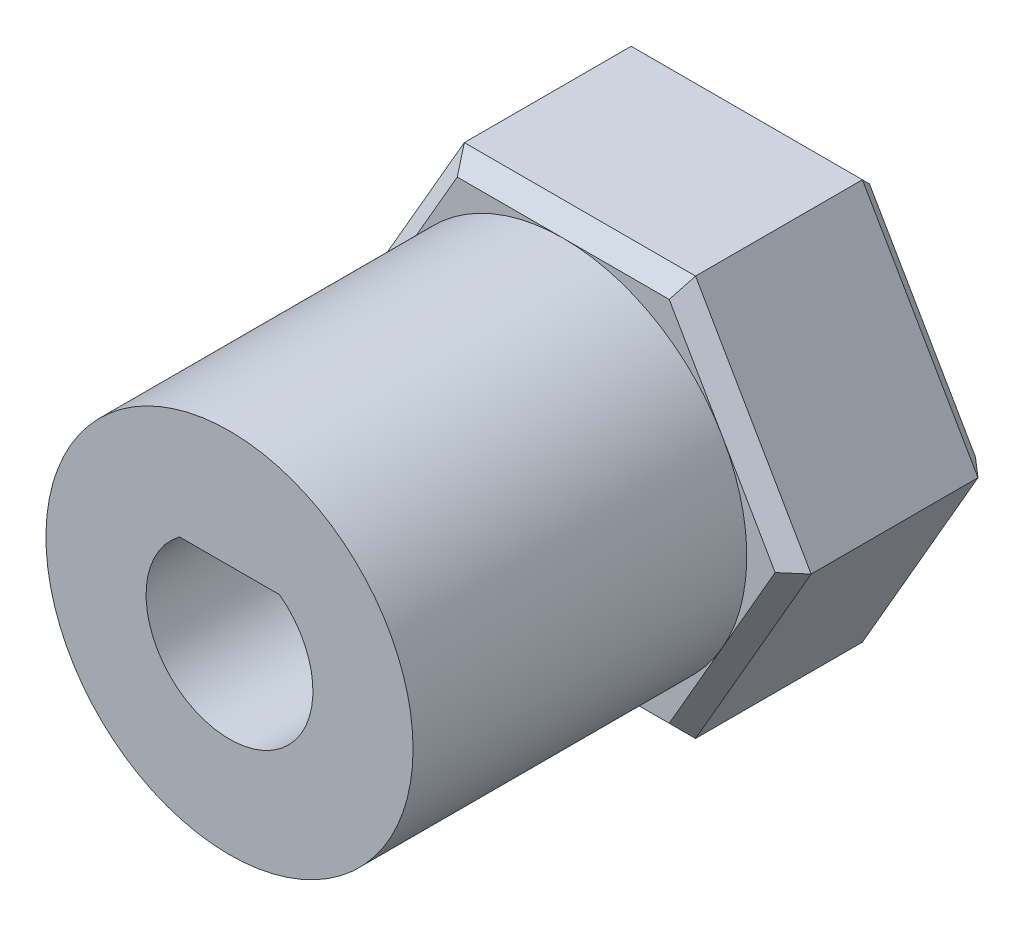
ISO-10303-21;
HEADER;
FILE_DESCRIPTION(('STEP AP214'),'2;1');
FILE_NAME('part.step','',(''),(''),'','','');
FILE_SCHEMA(('AUTOMOTIVE_DESIGN { 1 0 10303 214 1 1 1 1 }'));
ENDSEC;
DATA;
#1=APPLICATION_CONTEXT('core data for automotive mechanical design processes');
#2=APPLICATION_PROTOCOL_DEFINITION('international standard','automotive_design',2000,#1);
#3=PRODUCT_CONTEXT('',#1,'mechanical');
#4=PRODUCT('Part','Part','',(#3));
#5=PRODUCT_RELATED_PRODUCT_CATEGORY('part','',(#4));
#6=PRODUCT_DEFINITION_FORMATION('','',#4);
#7=PRODUCT_DEFINITION_CONTEXT('part definition',#1,'design');
#8=PRODUCT_DEFINITION('design','',#6,#7);
#9=PRODUCT_DEFINITION_SHAPE('','',#8);
#10=(LENGTH_UNIT() NAMED_UNIT(*) SI_UNIT(.MILLI.,.METRE.));
#11=(NAMED_UNIT(*) PLANE_ANGLE_UNIT() SI_UNIT($,.RADIAN.));
#12=(NAMED_UNIT(*) SI_UNIT($,.STERADIAN.) SOLID_ANGLE_UNIT());
#13=UNCERTAINTY_MEASURE_WITH_UNIT(LENGTH_MEASURE(1.E-05),#10,'distance_accuracy_value','');
#14=(GEOMETRIC_REPRESENTATION_CONTEXT(3) GLOBAL_UNCERTAINTY_ASSIGNED_CONTEXT((#13)) GLOBAL_UNIT_ASSIGNED_CONTEXT((#10,
#11,#12)) REPRESENTATION_CONTEXT('',''));
#15=CARTESIAN_POINT('',(0.,0.,0.));
#16=DIRECTION('',(0.,0.,1.));
#17=DIRECTION('',(1.,0.,0.));
#18=AXIS2_PLACEMENT_3D('',#15,#16,#17);
#19=CARTESIAN_POINT('',(0.,0.,6.));
#20=DIRECTION('',(0.,0.,1.));
#21=DIRECTION('',(1.,0.,0.));
#22=AXIS2_PLACEMENT_3D('',#19,#20,#21);
#23=PLANE('',#22);
#24=CARTESIAN_POINT('',(0.,0.,6.));
#25=DIRECTION('',(0.,0.,1.));
#26=DIRECTION('',(1.,0.,0.));
#27=AXIS2_PLACEMENT_3D('',#24,#25,#26);
#28=CIRCLE('',#27,5.5);
#29=CARTESIAN_POINT('',(4.76313972081441,2.75,6.));
#30=VERTEX_POINT('',#29);
#31=CARTESIAN_POINT('',(0.,5.5,6.));
#32=VERTEX_POINT('',#31);
#33=EDGE_CURVE('E60',#30,#32,#28,.T.);
#34=ORIENTED_EDGE('',*,*,#33,.F.);
#35=DIRECTION('',(-0.5,0.866025403784439,0.));
#36=VECTOR('',#35,1.);
#37=CARTESIAN_POINT('',(3.03108891324553,5.75,6.));
#38=LINE('',#37,#36);
#39=CARTESIAN_POINT('',(3.17542648054294,5.5,6.));
#40=VERTEX_POINT('',#39);
#41=EDGE_CURVE('E246',#30,#40,#38,.T.);
#42=ORIENTED_EDGE('',*,*,#41,.T.);
#43=DIRECTION('',(-1.,0.,0.));
#44=VECTOR('',#43,1.);
#45=CARTESIAN_POINT('',(-3.46410161513775,5.5,6.));
#46=LINE('',#45,#44);
#47=EDGE_CURVE('E242',#40,#32,#46,.T.);
#48=ORIENTED_EDGE('',*,*,#47,.T.);
#49=EDGE_LOOP('',(#34,#42,#48));
#50=FACE_BOUND('',#49,.T.);
#51=ADVANCED_FACE('F47',(#50),#23,.T.);
#52=CARTESIAN_POINT('',(-4.76313972081441,2.75,6.));
#53=VERTEX_POINT('',#52);
#54=EDGE_CURVE('E11',#32,#53,#28,.T.);
#55=ORIENTED_EDGE('',*,*,#54,.F.);
#56=CARTESIAN_POINT('',(-3.17542648054294,5.5,6.));
#57=VERTEX_POINT('',#56);
#58=EDGE_CURVE('E241',#32,#57,#46,.T.);
#59=ORIENTED_EDGE('',*,*,#58,.T.);
#60=DIRECTION('',(-0.5,-0.866025403784438,0.));
#61=VECTOR('',#60,1.);
#62=CARTESIAN_POINT('',(-6.49519052838329,-0.249999999999999,6.));
#63=LINE('',#62,#61);
#64=EDGE_CURVE('E238',#57,#53,#63,.T.);
#65=ORIENTED_EDGE('',*,*,#64,.T.);
#66=EDGE_LOOP('',(#55,#59,#65));
#67=FACE_BOUND('',#66,.T.);
#68=ADVANCED_FACE('F450',(#67),#23,.T.);
#69=CARTESIAN_POINT('',(-4.76313972081441,-2.75,6.));
#70=VERTEX_POINT('',#69);
#71=EDGE_CURVE('E58',#53,#70,#28,.T.);
#72=ORIENTED_EDGE('',*,*,#71,.F.);
#73=CARTESIAN_POINT('',(-6.35085296108588,0.,6.));
#74=VERTEX_POINT('',#73);
#75=EDGE_CURVE('E237',#53,#74,#63,.T.);
#76=ORIENTED_EDGE('',*,*,#75,.T.);
#77=DIRECTION('',(0.5,-0.866025403784439,0.));
#78=VECTOR('',#77,1.);
#79=CARTESIAN_POINT('',(-3.03108891324554,-5.75,6.));
#80=LINE('',#79,#78);
#81=EDGE_CURVE('E261',#74,#70,#80,.T.);
#82=ORIENTED_EDGE('',*,*,#81,.T.);
#83=EDGE_LOOP('',(#72,#76,#82));
#84=FACE_BOUND('',#83,.T.);
#85=ADVANCED_FACE('F449',(#84),#23,.T.);
#86=CARTESIAN_POINT('',(0.,-5.5,6.));
#87=VERTEX_POINT('',#86);
#88=EDGE_CURVE('E417',#70,#87,#28,.T.);
#89=ORIENTED_EDGE('',*,*,#88,.F.);
#90=CARTESIAN_POINT('',(-3.17542648054294,-5.49999999999999,6.));
#91=VERTEX_POINT('',#90);
#92=EDGE_CURVE('E260',#70,#91,#80,.T.);
#93=ORIENTED_EDGE('',*,*,#92,.T.);
#94=DIRECTION('',(1.,0.,0.));
#95=VECTOR('',#94,1.);
#96=CARTESIAN_POINT('',(3.46410161513775,-5.5,6.));
#97=LINE('',#96,#95);
#98=EDGE_CURVE('E256',#91,#87,#97,.T.);
#99=ORIENTED_EDGE('',*,*,#98,.T.);
#100=EDGE_LOOP('',(#89,#93,#99));
#101=FACE_BOUND('',#100,.T.);
#102=ADVANCED_FACE('F416',(#101),#23,.T.);
#103=CARTESIAN_POINT('',(4.76313972081441,-2.75,6.));
#104=VERTEX_POINT('',#103);
#105=EDGE_CURVE('E423',#87,#104,#28,.T.);
#106=ORIENTED_EDGE('',*,*,#105,.F.);
#107=CARTESIAN_POINT('',(3.17542648054294,-5.5,6.));
#108=VERTEX_POINT('',#107);
#109=EDGE_CURVE('E255',#87,#108,#97,.T.);
#110=ORIENTED_EDGE('',*,*,#109,.T.);
#111=DIRECTION('',(0.5,0.866025403784438,0.));
#112=VECTOR('',#111,1.);
#113=CARTESIAN_POINT('',(6.49519052838329,0.25,6.));
#114=LINE('',#113,#112);
#115=EDGE_CURVE('E251',#108,#104,#114,.T.);
#116=ORIENTED_EDGE('',*,*,#115,.T.);
#117=EDGE_LOOP('',(#106,#110,#116));
#118=FACE_BOUND('',#117,.T.);
#119=ADVANCED_FACE('F442',(#118),#23,.T.);
#120=CARTESIAN_POINT('',(0.,0.,6.));
#121=DIRECTION('',(0.,0.,1.));
#122=DIRECTION('',(1.,0.,0.));
#123=AXIS2_PLACEMENT_3D('',#120,#121,#122);
#124=CIRCLE('',#123,1.75);
#125=CARTESIAN_POINT('',(1.75,0.,6.));
#126=VERTEX_POINT('',#125);
#127=EDGE_CURVE('E204',#126,#126,#124,.T.);
#128=ORIENTED_EDGE('',*,*,#127,.F.);
#129=EDGE_LOOP('',(#128));
#130=FACE_BOUND('',#129,.T.);
#131=DIRECTION('',(-1.,0.,0.));
#132=VECTOR('',#131,1.);
#133=CARTESIAN_POINT('',(-1.5,2.,6.));
#134=LINE('',#133,#132);
#135=CARTESIAN_POINT('',(1.5,2.,6.));
#136=VERTEX_POINT('',#135);
#137=CARTESIAN_POINT('',(-1.5,2.,6.));
#138=VERTEX_POINT('',#137);
#139=EDGE_CURVE('E187',#136,#138,#134,.T.);
#140=ORIENTED_EDGE('',*,*,#139,.T.);
#141=CARTESIAN_POINT('',(0.,0.,6.));
#142=DIRECTION('',(0.,0.,1.));
#143=DIRECTION('',(1.,0.,0.));
#144=AXIS2_PLACEMENT_3D('',#141,#142,#143);
#145=CIRCLE('',#144,2.5);
#146=EDGE_CURVE('E181',#138,#136,#145,.T.);
#147=ORIENTED_EDGE('',*,*,#146,.T.);
#148=EDGE_LOOP('',(#140,#147));
#149=FACE_BOUND('',#148,.T.);
#150=ADVANCED_FACE('F494',(#130,#149),#23,.T.);
#151=EDGE_CURVE('E203',#104,#30,#28,.T.);
#152=ORIENTED_EDGE('',*,*,#151,.F.);
#153=CARTESIAN_POINT('',(6.35085296108588,0.,6.));
#154=VERTEX_POINT('',#153);
#155=EDGE_CURVE('E250',#104,#154,#114,.T.);
#156=ORIENTED_EDGE('',*,*,#155,.T.);
#157=EDGE_CURVE('E247',#154,#30,#38,.T.);
#158=ORIENTED_EDGE('',*,*,#157,.T.);
#159=EDGE_LOOP('',(#152,#156,#158));
#160=FACE_BOUND('',#159,.T.);
#161=ADVANCED_FACE('F431',(#160),#23,.T.);
#162=CARTESIAN_POINT('',(0.,0.,0.));
#163=DIRECTION('',(0.,0.,1.));
#164=DIRECTION('',(1.,0.,0.));
#165=AXIS2_PLACEMENT_3D('',#162,#163,#164);
#166=PLANE('',#165);
#167=DIRECTION('',(-0.5,0.866025403784439,0.));
#168=VECTOR('',#167,1.);
#169=CARTESIAN_POINT('',(-4.76313972081441,-2.75,0.));
#170=LINE('',#169,#168);
#171=CARTESIAN_POINT('',(-3.17542648054294,-5.49999999999999,0.));
#172=VERTEX_POINT('',#171);
#173=CARTESIAN_POINT('',(-6.35085296108588,0.,0.));
#174=VERTEX_POINT('',#173);
#175=EDGE_CURVE('E315',#172,#174,#170,.T.);
#176=ORIENTED_EDGE('',*,*,#175,.T.);
#177=DIRECTION('',(0.5,0.866025403784438,0.));
#178=VECTOR('',#177,1.);
#179=CARTESIAN_POINT('',(-4.76313972081441,2.75,0.));
#180=LINE('',#179,#178);
#181=CARTESIAN_POINT('',(-3.17542648054294,5.5,0.));
#182=VERTEX_POINT('',#181);
#183=EDGE_CURVE('E318',#174,#182,#180,.T.);
#184=ORIENTED_EDGE('',*,*,#183,.T.);
#185=DIRECTION('',(1.,0.,0.));
#186=VECTOR('',#185,1.);
#187=CARTESIAN_POINT('',(0.,5.5,0.));
#188=LINE('',#187,#186);
#189=CARTESIAN_POINT('',(3.17542648054294,5.5,0.));
#190=VERTEX_POINT('',#189);
#191=EDGE_CURVE('E303',#182,#190,#188,.T.);
#192=ORIENTED_EDGE('',*,*,#191,.T.);
#193=DIRECTION('',(0.5,-0.866025403784439,0.));
#194=VECTOR('',#193,1.);
#195=CARTESIAN_POINT('',(4.76313972081441,2.75,0.));
#196=LINE('',#195,#194);
#197=CARTESIAN_POINT('',(6.35085296108588,0.,0.));
#198=VERTEX_POINT('',#197);
#199=EDGE_CURVE('E306',#190,#198,#196,.T.);
#200=ORIENTED_EDGE('',*,*,#199,.T.);
#201=DIRECTION('',(-0.5,-0.866025403784438,0.));
#202=VECTOR('',#201,1.);
#203=CARTESIAN_POINT('',(4.76313972081441,-2.75,0.));
#204=LINE('',#203,#202);
#205=CARTESIAN_POINT('',(3.17542648054294,-5.49999999999999,0.));
#206=VERTEX_POINT('',#205);
#207=EDGE_CURVE('E309',#198,#206,#204,.T.);
#208=ORIENTED_EDGE('',*,*,#207,.T.);
#209=DIRECTION('',(-1.,0.,0.));
#210=VECTOR('',#209,1.);
#211=CARTESIAN_POINT('',(0.,-5.49999999999999,0.));
#212=LINE('',#211,#210);
#213=EDGE_CURVE('E312',#206,#172,#212,.T.);
#214=ORIENTED_EDGE('',*,*,#213,.T.);
#215=EDGE_LOOP('',(#176,#184,#192,#200,#208,#214));
#216=FACE_BOUND('',#215,.T.);
#217=CARTESIAN_POINT('',(0.,0.,0.));
#218=DIRECTION('',(0.,0.,1.));
#219=DIRECTION('',(1.,0.,0.));
#220=AXIS2_PLACEMENT_3D('',#217,#218,#219);
#221=CIRCLE('',#220,1.75);
#222=CARTESIAN_POINT('',(1.75,0.,0.));
#223=VERTEX_POINT('',#222);
#224=EDGE_CURVE('E209',#223,#223,#221,.T.);
#225=ORIENTED_EDGE('',*,*,#224,.T.);
#226=EDGE_LOOP('',(#225));
#227=FACE_BOUND('',#226,.T.);
#228=ADVANCED_FACE('F375',(#216,#227),#166,.F.);
#229=CARTESIAN_POINT('',(6.92820323027551,0.,6.));
#230=DIRECTION('',(-0.866025403784439,-0.5,0.));
#231=DIRECTION('',(0.5,-0.866025403784439,0.));
#232=AXIS2_PLACEMENT_3D('',#229,#230,#231);
#233=PLANE('',#232);
#234=DIRECTION('',(0.,0.,-1.));
#235=VECTOR('',#234,1.);
#236=CARTESIAN_POINT('',(3.46410161513775,6.,6.));
#237=LINE('',#236,#235);
#238=CARTESIAN_POINT('',(3.46410161513775,6.,5.5));
#239=VERTEX_POINT('',#238);
#240=CARTESIAN_POINT('',(3.46410161513775,6.,0.500000000000004));
#241=VERTEX_POINT('',#240);
#242=EDGE_CURVE('E233',#239,#241,#237,.T.);
#243=ORIENTED_EDGE('',*,*,#242,.F.);
#244=DIRECTION('',(0.5,-0.866025403784439,0.));
#245=VECTOR('',#244,1.);
#246=CARTESIAN_POINT('',(6.92820323027551,0.,5.5));
#247=LINE('',#246,#245);
#248=CARTESIAN_POINT('',(6.92820323027551,0.,5.5));
#249=VERTEX_POINT('',#248);
#250=EDGE_CURVE('E287',#239,#249,#247,.T.);
#251=ORIENTED_EDGE('',*,*,#250,.T.);
#252=DIRECTION('',(0.,0.,-1.));
#253=VECTOR('',#252,1.);
#254=CARTESIAN_POINT('',(6.92820323027551,0.,6.));
#255=LINE('',#254,#253);
#256=CARTESIAN_POINT('',(6.92820323027551,0.,0.500000000000004));
#257=VERTEX_POINT('',#256);
#258=EDGE_CURVE('E208',#249,#257,#255,.T.);
#259=ORIENTED_EDGE('',*,*,#258,.T.);
#260=DIRECTION('',(-0.5,0.866025403784439,0.));
#261=VECTOR('',#260,1.);
#262=CARTESIAN_POINT('',(6.92820323027551,0.,0.500000000000004));
#263=LINE('',#262,#261);
#264=EDGE_CURVE('E284',#257,#241,#263,.T.);
#265=ORIENTED_EDGE('',*,*,#264,.T.);
#266=EDGE_LOOP('',(#243,#251,#259,#265));
#267=FACE_BOUND('',#266,.T.);
#268=ADVANCED_FACE('F457',(#267),#233,.F.);
#269=CARTESIAN_POINT('',(3.46410161513775,6.,6.));
#270=DIRECTION('',(0.,-1.,0.));
#271=DIRECTION('',(0.,0.,-1.));
#272=AXIS2_PLACEMENT_3D('',#269,#270,#271);
#273=PLANE('',#272);
#274=DIRECTION('',(0.,0.,-1.));
#275=VECTOR('',#274,1.);
#276=CARTESIAN_POINT('',(-3.46410161513775,6.,6.));
#277=LINE('',#276,#275);
#278=CARTESIAN_POINT('',(-3.46410161513775,6.,5.5));
#279=VERTEX_POINT('',#278);
#280=CARTESIAN_POINT('',(-3.46410161513775,6.,0.500000000000004));
#281=VERTEX_POINT('',#280);
#282=EDGE_CURVE('E229',#279,#281,#277,.T.);
#283=ORIENTED_EDGE('',*,*,#282,.F.);
#284=DIRECTION('',(1.,0.,0.));
#285=VECTOR('',#284,1.);
#286=CARTESIAN_POINT('',(3.46410161513775,6.,5.5));
#287=LINE('',#286,#285);
#288=EDGE_CURVE('E293',#279,#239,#287,.T.);
#289=ORIENTED_EDGE('',*,*,#288,.T.);
#290=ORIENTED_EDGE('',*,*,#242,.T.);
#291=DIRECTION('',(-1.,0.,0.));
#292=VECTOR('',#291,1.);
#293=CARTESIAN_POINT('',(3.46410161513775,6.,0.500000000000004));
#294=LINE('',#293,#292);
#295=EDGE_CURVE('E290',#241,#281,#294,.T.);
#296=ORIENTED_EDGE('',*,*,#295,.T.);
#297=EDGE_LOOP('',(#283,#289,#290,#296));
#298=FACE_BOUND('',#297,.T.);
#299=ADVANCED_FACE('F387',(#298),#273,.F.);
#300=CARTESIAN_POINT('',(-3.46410161513775,6.,6.));
#301=DIRECTION('',(0.866025403784438,-0.5,0.));
#302=DIRECTION('',(0.5,0.866025403784439,0.));
#303=AXIS2_PLACEMENT_3D('',#300,#301,#302);
#304=PLANE('',#303);
#305=DIRECTION('',(0.,0.,-1.));
#306=VECTOR('',#305,1.);
#307=CARTESIAN_POINT('',(-6.92820323027551,0.,6.));
#308=LINE('',#307,#306);
#309=CARTESIAN_POINT('',(-6.92820323027551,0.,5.5));
#310=VERTEX_POINT('',#309);
#311=CARTESIAN_POINT('',(-6.92820323027551,0.,0.500000000000004));
#312=VERTEX_POINT('',#311);
#313=EDGE_CURVE('E225',#310,#312,#308,.T.);
#314=ORIENTED_EDGE('',*,*,#313,.F.);
#315=DIRECTION('',(0.5,0.866025403784439,0.));
#316=VECTOR('',#315,1.);
#317=CARTESIAN_POINT('',(-3.46410161513775,6.,5.5));
#318=LINE('',#317,#316);
#319=EDGE_CURVE('E300',#310,#279,#318,.T.);
#320=ORIENTED_EDGE('',*,*,#319,.T.);
#321=ORIENTED_EDGE('',*,*,#282,.T.);
#322=DIRECTION('',(-0.5,-0.866025403784439,0.));
#323=VECTOR('',#322,1.);
#324=CARTESIAN_POINT('',(-3.46410161513775,6.,0.500000000000004));
#325=LINE('',#324,#323);
#326=EDGE_CURVE('E296',#281,#312,#325,.T.);
#327=ORIENTED_EDGE('',*,*,#326,.T.);
#328=EDGE_LOOP('',(#314,#320,#321,#327));
#329=FACE_BOUND('',#328,.T.);
#330=ADVANCED_FACE('F392',(#329),#304,.F.);
#331=CARTESIAN_POINT('',(-6.92820323027551,0.,6.));
#332=DIRECTION('',(0.866025403784439,0.5,0.));
#333=DIRECTION('',(-0.5,0.866025403784439,0.));
#334=AXIS2_PLACEMENT_3D('',#331,#332,#333);
#335=PLANE('',#334);
#336=DIRECTION('',(0.,0.,-1.));
#337=VECTOR('',#336,1.);
#338=CARTESIAN_POINT('',(-3.46410161513776,-6.,6.));
#339=LINE('',#338,#337);
#340=CARTESIAN_POINT('',(-3.46410161513776,-6.,5.5));
#341=VERTEX_POINT('',#340);
#342=CARTESIAN_POINT('',(-3.46410161513776,-6.,0.500000000000004));
#343=VERTEX_POINT('',#342);
#344=EDGE_CURVE('E221',#341,#343,#339,.T.);
#345=ORIENTED_EDGE('',*,*,#344,.F.);
#346=DIRECTION('',(-0.5,0.866025403784439,0.));
#347=VECTOR('',#346,1.);
#348=CARTESIAN_POINT('',(-6.92820323027551,0.,5.5));
#349=LINE('',#348,#347);
#350=EDGE_CURVE('E268',#341,#310,#349,.T.);
#351=ORIENTED_EDGE('',*,*,#350,.T.);
#352=ORIENTED_EDGE('',*,*,#313,.T.);
#353=DIRECTION('',(0.5,-0.866025403784439,0.));
#354=VECTOR('',#353,1.);
#355=CARTESIAN_POINT('',(-6.92820323027551,0.,0.500000000000004));
#356=LINE('',#355,#354);
#357=EDGE_CURVE('E265',#312,#343,#356,.T.);
#358=ORIENTED_EDGE('',*,*,#357,.T.);
#359=EDGE_LOOP('',(#345,#351,#352,#358));
#360=FACE_BOUND('',#359,.T.);
#361=ADVANCED_FACE('F404',(#360),#335,.F.);
#362=CARTESIAN_POINT('',(-3.46410161513776,-6.,6.));
#363=DIRECTION('',(0.,1.,0.));
#364=DIRECTION('',(-1.,0.,0.));
#365=AXIS2_PLACEMENT_3D('',#362,#363,#364);
#366=PLANE('',#365);
#367=DIRECTION('',(0.,0.,-1.));
#368=VECTOR('',#367,1.);
#369=CARTESIAN_POINT('',(3.46410161513775,-6.,6.));
#370=LINE('',#369,#368);
#371=CARTESIAN_POINT('',(3.46410161513775,-6.,5.5));
#372=VERTEX_POINT('',#371);
#373=CARTESIAN_POINT('',(3.46410161513775,-6.,0.500000000000005));
#374=VERTEX_POINT('',#373);
#375=EDGE_CURVE('E217',#372,#374,#370,.T.);
#376=ORIENTED_EDGE('',*,*,#375,.F.);
#377=DIRECTION('',(-1.,0.,0.));
#378=VECTOR('',#377,1.);
#379=CARTESIAN_POINT('',(-3.46410161513776,-6.,5.5));
#380=LINE('',#379,#378);
#381=EDGE_CURVE('E275',#372,#341,#380,.T.);
#382=ORIENTED_EDGE('',*,*,#381,.T.);
#383=ORIENTED_EDGE('',*,*,#344,.T.);
#384=DIRECTION('',(1.,0.,0.));
#385=VECTOR('',#384,1.);
#386=CARTESIAN_POINT('',(-3.46410161513776,-6.,0.500000000000004));
#387=LINE('',#386,#385);
#388=EDGE_CURVE('E272',#343,#374,#387,.T.);
#389=ORIENTED_EDGE('',*,*,#388,.T.);
#390=EDGE_LOOP('',(#376,#382,#383,#389));
#391=FACE_BOUND('',#390,.T.);
#392=ADVANCED_FACE('F465',(#391),#366,.F.);
#393=CARTESIAN_POINT('',(3.46410161513775,-6.,6.));
#394=DIRECTION('',(-0.866025403784438,0.5,0.));
#395=DIRECTION('',(-0.5,-0.866025403784438,0.));
#396=AXIS2_PLACEMENT_3D('',#393,#394,#395);
#397=PLANE('',#396);
#398=ORIENTED_EDGE('',*,*,#258,.F.);
#399=DIRECTION('',(-0.5,-0.866025403784438,0.));
#400=VECTOR('',#399,1.);
#401=CARTESIAN_POINT('',(3.46410161513775,-6.,5.5));
#402=LINE('',#401,#400);
#403=EDGE_CURVE('E281',#249,#372,#402,.T.);
#404=ORIENTED_EDGE('',*,*,#403,.T.);
#405=ORIENTED_EDGE('',*,*,#375,.T.);
#406=DIRECTION('',(0.5,0.866025403784438,0.));
#407=VECTOR('',#406,1.);
#408=CARTESIAN_POINT('',(3.46410161513775,-6.,0.500000000000005));
#409=LINE('',#408,#407);
#410=EDGE_CURVE('E278',#374,#257,#409,.T.);
#411=ORIENTED_EDGE('',*,*,#410,.T.);
#412=EDGE_LOOP('',(#398,#404,#405,#411));
#413=FACE_BOUND('',#412,.T.);
#414=ADVANCED_FACE('F463',(#413),#397,.F.);
#415=CARTESIAN_POINT('',(0.,0.,6.));
#416=DIRECTION('',(0.,0.,-1.));
#417=DIRECTION('',(-1.,0.,0.));
#418=AXIS2_PLACEMENT_3D('',#415,#416,#417);
#419=CYLINDRICAL_SURFACE('',#418,1.75);
#420=ORIENTED_EDGE('',*,*,#127,.T.);
#421=EDGE_LOOP('',(#420));
#422=FACE_BOUND('',#421,.T.);
#423=ORIENTED_EDGE('',*,*,#224,.F.);
#424=EDGE_LOOP('',(#423));
#425=FACE_BOUND('',#424,.T.);
#426=ADVANCED_FACE('F507',(#422,#425),#419,.F.);
#427=CARTESIAN_POINT('',(4.76313972081441,2.75,6.));
#428=DIRECTION('',(0.612372435695794,0.353553390593273,0.707106781186548));
#429=DIRECTION('',(0.5,-0.866025403784439,0.));
#430=AXIS2_PLACEMENT_3D('',#427,#428,#429);
#431=PLANE('',#430);
#432=DIRECTION('',(0.755928946018455,0.,-0.654653670707977));
#433=VECTOR('',#432,1.);
#434=CARTESIAN_POINT('',(5.44358825235933,0.,6.78571428571428));
#435=LINE('',#434,#433);
#436=EDGE_CURVE('E337',#249,#154,#435,.F.);
#437=ORIENTED_EDGE('',*,*,#436,.F.);
#438=ORIENTED_EDGE('',*,*,#250,.F.);
#439=DIRECTION('',(0.377964473009229,0.654653670707977,-0.654653670707977));
#440=VECTOR('',#439,1.);
#441=CARTESIAN_POINT('',(2.72179412617966,4.71428571428571,6.78571428571429));
#442=LINE('',#441,#440);
#443=EDGE_CURVE('E213',#40,#239,#442,.T.);
#444=ORIENTED_EDGE('',*,*,#443,.F.);
#445=ORIENTED_EDGE('',*,*,#41,.F.);
#446=ORIENTED_EDGE('',*,*,#157,.F.);
#447=EDGE_LOOP('',(#437,#438,#444,#445,#446));
#448=FACE_BOUND('',#447,.T.);
#449=ADVANCED_FACE('F460',(#448),#431,.T.);
#450=CARTESIAN_POINT('',(0.,5.5,6.));
#451=DIRECTION('',(0.,0.707106781186548,0.707106781186548));
#452=DIRECTION('',(1.,0.,0.));
#453=AXIS2_PLACEMENT_3D('',#450,#451,#452);
#454=PLANE('',#453);
#455=ORIENTED_EDGE('',*,*,#443,.T.);
#456=ORIENTED_EDGE('',*,*,#288,.F.);
#457=DIRECTION('',(-0.377964473009227,0.654653670707977,-0.654653670707977));
#458=VECTOR('',#457,1.);
#459=CARTESIAN_POINT('',(-2.72179412617966,4.71428571428571,6.78571428571428));
#460=LINE('',#459,#458);
#461=EDGE_CURVE('E333',#57,#279,#460,.T.);
#462=ORIENTED_EDGE('',*,*,#461,.F.);
#463=ORIENTED_EDGE('',*,*,#58,.F.);
#464=ORIENTED_EDGE('',*,*,#47,.F.);
#465=EDGE_LOOP('',(#455,#456,#462,#463,#464));
#466=FACE_BOUND('',#465,.T.);
#467=ADVANCED_FACE('F453',(#466),#454,.T.);
#468=CARTESIAN_POINT('',(4.76313972081441,-2.75,6.));
#469=DIRECTION('',(0.612372435695795,-0.353553390593274,0.707106781186547));
#470=DIRECTION('',(-0.5,-0.866025403784438,0.));
#471=AXIS2_PLACEMENT_3D('',#468,#469,#470);
#472=PLANE('',#471);
#473=ORIENTED_EDGE('',*,*,#436,.T.);
#474=ORIENTED_EDGE('',*,*,#155,.F.);
#475=ORIENTED_EDGE('',*,*,#115,.F.);
#476=DIRECTION('',(0.377964473009226,-0.654653670707977,-0.654653670707977));
#477=VECTOR('',#476,1.);
#478=CARTESIAN_POINT('',(2.72179412617966,-4.71428571428571,6.78571428571429));
#479=LINE('',#478,#477);
#480=EDGE_CURVE('E329',#372,#108,#479,.F.);
#481=ORIENTED_EDGE('',*,*,#480,.F.);
#482=ORIENTED_EDGE('',*,*,#403,.F.);
#483=EDGE_LOOP('',(#473,#474,#475,#481,#482));
#484=FACE_BOUND('',#483,.T.);
#485=ADVANCED_FACE('F436',(#484),#472,.T.);
#486=CARTESIAN_POINT('',(-4.76313972081441,2.75,6.));
#487=DIRECTION('',(-0.612372435695794,0.353553390593274,0.707106781186547));
#488=DIRECTION('',(0.5,0.866025403784439,0.));
#489=AXIS2_PLACEMENT_3D('',#486,#487,#488);
#490=PLANE('',#489);
#491=ORIENTED_EDGE('',*,*,#461,.T.);
#492=ORIENTED_EDGE('',*,*,#319,.F.);
#493=DIRECTION('',(0.755928946018454,0.,0.654653670707977));
#494=VECTOR('',#493,1.);
#495=CARTESIAN_POINT('',(-5.44358825235932,0.,6.78571428571429));
#496=LINE('',#495,#494);
#497=EDGE_CURVE('E326',#74,#310,#496,.F.);
#498=ORIENTED_EDGE('',*,*,#497,.F.);
#499=ORIENTED_EDGE('',*,*,#75,.F.);
#500=ORIENTED_EDGE('',*,*,#64,.F.);
#501=EDGE_LOOP('',(#491,#492,#498,#499,#500));
#502=FACE_BOUND('',#501,.T.);
#503=ADVANCED_FACE('F396',(#502),#490,.T.);
#504=CARTESIAN_POINT('',(0.,-5.5,6.));
#505=DIRECTION('',(0.,-0.707106781186548,0.707106781186548));
#506=DIRECTION('',(-1.,0.,0.));
#507=AXIS2_PLACEMENT_3D('',#504,#505,#506);
#508=PLANE('',#507);
#509=ORIENTED_EDGE('',*,*,#480,.T.);
#510=ORIENTED_EDGE('',*,*,#109,.F.);
#511=ORIENTED_EDGE('',*,*,#98,.F.);
#512=DIRECTION('',(-0.377964473009228,-0.654653670707977,-0.654653670707977));
#513=VECTOR('',#512,1.);
#514=CARTESIAN_POINT('',(-2.72179412617966,-4.71428571428571,6.78571428571429));
#515=LINE('',#514,#513);
#516=EDGE_CURVE('E322',#341,#91,#515,.F.);
#517=ORIENTED_EDGE('',*,*,#516,.F.);
#518=ORIENTED_EDGE('',*,*,#381,.F.);
#519=EDGE_LOOP('',(#509,#510,#511,#517,#518));
#520=FACE_BOUND('',#519,.T.);
#521=ADVANCED_FACE('F412',(#520),#508,.T.);
#522=CARTESIAN_POINT('',(-4.76313972081441,-2.75,6.));
#523=DIRECTION('',(-0.612372435695795,-0.353553390593274,0.707106781186548));
#524=DIRECTION('',(-0.5,0.866025403784439,0.));
#525=AXIS2_PLACEMENT_3D('',#522,#523,#524);
#526=PLANE('',#525);
#527=ORIENTED_EDGE('',*,*,#497,.T.);
#528=ORIENTED_EDGE('',*,*,#350,.F.);
#529=ORIENTED_EDGE('',*,*,#516,.T.);
#530=ORIENTED_EDGE('',*,*,#92,.F.);
#531=ORIENTED_EDGE('',*,*,#81,.F.);
#532=EDGE_LOOP('',(#527,#528,#529,#530,#531));
#533=FACE_BOUND('',#532,.T.);
#534=ADVANCED_FACE('F407',(#533),#526,.T.);
#535=CARTESIAN_POINT('',(3.46410161513775,-6.,0.500000000000004));
#536=DIRECTION('',(-0.612372435695795,0.353553390593274,0.707106781186547));
#537=DIRECTION('',(0.5,0.866025403784438,0.));
#538=AXIS2_PLACEMENT_3D('',#535,#536,#537);
#539=PLANE('',#538);
#540=DIRECTION('',(-0.377964473009227,0.654653670707977,-0.654653670707977));
#541=VECTOR('',#540,1.);
#542=CARTESIAN_POINT('',(3.46410161513775,-6.,0.500000000000004));
#543=LINE('',#542,#541);
#544=EDGE_CURVE('E356',#206,#374,#543,.F.);
#545=ORIENTED_EDGE('',*,*,#544,.F.);
#546=ORIENTED_EDGE('',*,*,#207,.F.);
#547=DIRECTION('',(-0.755928946018455,0.,-0.654653670707977));
#548=VECTOR('',#547,1.);
#549=CARTESIAN_POINT('',(6.92820323027551,0.,0.500000000000004));
#550=LINE('',#549,#548);
#551=EDGE_CURVE('E52',#257,#198,#550,.T.);
#552=ORIENTED_EDGE('',*,*,#551,.F.);
#553=ORIENTED_EDGE('',*,*,#410,.F.);
#554=EDGE_LOOP('',(#545,#546,#552,#553));
#555=FACE_BOUND('',#554,.T.);
#556=ADVANCED_FACE('F50',(#555),#539,.F.);
#557=CARTESIAN_POINT('',(6.92820323027551,0.,0.500000000000004));
#558=DIRECTION('',(-0.612372435695794,-0.353553390593274,0.707106781186548));
#559=DIRECTION('',(-0.5,0.866025403784439,0.));
#560=AXIS2_PLACEMENT_3D('',#557,#558,#559);
#561=PLANE('',#560);
#562=ORIENTED_EDGE('',*,*,#551,.T.);
#563=ORIENTED_EDGE('',*,*,#199,.F.);
#564=DIRECTION('',(-0.377964473009228,-0.654653670707977,-0.654653670707977));
#565=VECTOR('',#564,1.);
#566=CARTESIAN_POINT('',(3.46410161513775,6.,0.500000000000004));
#567=LINE('',#566,#565);
#568=EDGE_CURVE('E353',#241,#190,#567,.T.);
#569=ORIENTED_EDGE('',*,*,#568,.F.);
#570=ORIENTED_EDGE('',*,*,#264,.F.);
#571=EDGE_LOOP('',(#562,#563,#569,#570));
#572=FACE_BOUND('',#571,.T.);
#573=ADVANCED_FACE('F369',(#572),#561,.F.);
#574=CARTESIAN_POINT('',(-3.46410161513776,-6.,0.500000000000004));
#575=DIRECTION('',(0.,0.707106781186547,0.707106781186547));
#576=DIRECTION('',(1.,0.,0.));
#577=AXIS2_PLACEMENT_3D('',#574,#575,#576);
#578=PLANE('',#577);
#579=ORIENTED_EDGE('',*,*,#544,.T.);
#580=ORIENTED_EDGE('',*,*,#388,.F.);
#581=DIRECTION('',(0.377964473009228,0.654653670707977,-0.654653670707977));
#582=VECTOR('',#581,1.);
#583=CARTESIAN_POINT('',(-3.46410161513776,-6.,0.500000000000004));
#584=LINE('',#583,#582);
#585=EDGE_CURVE('E349',#172,#343,#584,.F.);
#586=ORIENTED_EDGE('',*,*,#585,.F.);
#587=ORIENTED_EDGE('',*,*,#213,.F.);
#588=EDGE_LOOP('',(#579,#580,#586,#587));
#589=FACE_BOUND('',#588,.T.);
#590=ADVANCED_FACE('F466',(#589),#578,.F.);
#591=CARTESIAN_POINT('',(3.46410161513775,6.,0.500000000000004));
#592=DIRECTION('',(0.,-0.707106781186547,0.707106781186547));
#593=DIRECTION('',(-1.,0.,0.));
#594=AXIS2_PLACEMENT_3D('',#591,#592,#593);
#595=PLANE('',#594);
#596=ORIENTED_EDGE('',*,*,#568,.T.);
#597=ORIENTED_EDGE('',*,*,#191,.F.);
#598=DIRECTION('',(-0.377964473009226,0.654653670707977,0.654653670707977));
#599=VECTOR('',#598,1.);
#600=CARTESIAN_POINT('',(-2.47435829652697,4.28571428571429,-1.21428571428571));
#601=LINE('',#600,#599);
#602=EDGE_CURVE('E346',#281,#182,#601,.F.);
#603=ORIENTED_EDGE('',*,*,#602,.F.);
#604=ORIENTED_EDGE('',*,*,#295,.F.);
#605=EDGE_LOOP('',(#596,#597,#603,#604));
#606=FACE_BOUND('',#605,.T.);
#607=ADVANCED_FACE('F382',(#606),#595,.F.);
#608=CARTESIAN_POINT('',(-6.92820323027551,0.,0.500000000000004));
#609=DIRECTION('',(0.612372435695794,0.353553390593273,0.707106781186548));
#610=DIRECTION('',(0.5,-0.866025403784439,0.));
#611=AXIS2_PLACEMENT_3D('',#608,#609,#610);
#612=PLANE('',#611);
#613=ORIENTED_EDGE('',*,*,#585,.T.);
#614=ORIENTED_EDGE('',*,*,#357,.F.);
#615=DIRECTION('',(0.755928946018454,0.,-0.654653670707977));
#616=VECTOR('',#615,1.);
#617=CARTESIAN_POINT('',(-6.92820323027551,0.,0.500000000000004));
#618=LINE('',#617,#616);
#619=EDGE_CURVE('E199',#174,#312,#618,.F.);
#620=ORIENTED_EDGE('',*,*,#619,.F.);
#621=ORIENTED_EDGE('',*,*,#175,.F.);
#622=EDGE_LOOP('',(#613,#614,#620,#621));
#623=FACE_BOUND('',#622,.T.);
#624=ADVANCED_FACE('F470',(#623),#612,.F.);
#625=CARTESIAN_POINT('',(-3.46410161513775,6.,0.500000000000004));
#626=DIRECTION('',(0.612372435695795,-0.353553390593274,0.707106781186547));
#627=DIRECTION('',(-0.5,-0.866025403784439,0.));
#628=AXIS2_PLACEMENT_3D('',#625,#626,#627);
#629=PLANE('',#628);
#630=ORIENTED_EDGE('',*,*,#602,.T.);
#631=ORIENTED_EDGE('',*,*,#183,.F.);
#632=ORIENTED_EDGE('',*,*,#619,.T.);
#633=ORIENTED_EDGE('',*,*,#326,.F.);
#634=EDGE_LOOP('',(#630,#631,#632,#633));
#635=FACE_BOUND('',#634,.T.);
#636=ADVANCED_FACE('F473',(#635),#629,.F.);
#637=CARTESIAN_POINT('',(0.,0.,16.));
#638=DIRECTION('',(0.,0.,1.));
#639=DIRECTION('',(1.,0.,0.));
#640=AXIS2_PLACEMENT_3D('',#637,#638,#639);
#641=PLANE('',#640);
#642=CARTESIAN_POINT('',(0.,0.,16.));
#643=DIRECTION('',(0.,0.,1.));
#644=DIRECTION('',(1.,0.,0.));
#645=AXIS2_PLACEMENT_3D('',#642,#643,#644);
#646=CIRCLE('',#645,5.5);
#647=CARTESIAN_POINT('',(5.5,0.,16.));
#648=VERTEX_POINT('',#647);
#649=EDGE_CURVE('E196',#648,#648,#646,.T.);
#650=ORIENTED_EDGE('',*,*,#649,.T.);
#651=EDGE_LOOP('',(#650));
#652=FACE_BOUND('',#651,.T.);
#653=DIRECTION('',(-1.,0.,0.));
#654=VECTOR('',#653,1.);
#655=CARTESIAN_POINT('',(-1.5,2.,16.));
#656=LINE('',#655,#654);
#657=CARTESIAN_POINT('',(1.5,2.,16.));
#658=VERTEX_POINT('',#657);
#659=CARTESIAN_POINT('',(-1.5,2.,16.));
#660=VERTEX_POINT('',#659);
#661=EDGE_CURVE('E168',#658,#660,#656,.T.);
#662=ORIENTED_EDGE('',*,*,#661,.F.);
#663=CARTESIAN_POINT('',(0.,0.,16.));
#664=DIRECTION('',(0.,0.,1.));
#665=DIRECTION('',(1.,0.,0.));
#666=AXIS2_PLACEMENT_3D('',#663,#664,#665);
#667=CIRCLE('',#666,2.5);
#668=EDGE_CURVE('E176',#660,#658,#667,.T.);
#669=ORIENTED_EDGE('',*,*,#668,.F.);
#670=EDGE_LOOP('',(#662,#669));
#671=FACE_BOUND('',#670,.T.);
#672=ADVANCED_FACE('F185',(#652,#671),#641,.T.);
#673=CARTESIAN_POINT('',(0.,0.,16.));
#674=DIRECTION('',(0.,0.,-1.));
#675=DIRECTION('',(-1.,0.,0.));
#676=AXIS2_PLACEMENT_3D('',#673,#674,#675);
#677=CYLINDRICAL_SURFACE('',#676,5.5);
#678=ORIENTED_EDGE('',*,*,#649,.F.);
#679=EDGE_LOOP('',(#678));
#680=FACE_BOUND('',#679,.T.);
#681=ORIENTED_EDGE('',*,*,#33,.T.);
#682=ORIENTED_EDGE('',*,*,#54,.T.);
#683=ORIENTED_EDGE('',*,*,#71,.T.);
#684=ORIENTED_EDGE('',*,*,#88,.T.);
#685=ORIENTED_EDGE('',*,*,#105,.T.);
#686=ORIENTED_EDGE('',*,*,#151,.T.);
#687=EDGE_LOOP('',(#681,#682,#683,#684,#685,#686));
#688=FACE_BOUND('',#687,.T.);
#689=ADVANCED_FACE('F421',(#680,#688),#677,.T.);
#690=CARTESIAN_POINT('',(0.,0.,16.));
#691=DIRECTION('',(0.,0.,-1.));
#692=DIRECTION('',(-1.,0.,0.));
#693=AXIS2_PLACEMENT_3D('',#690,#691,#692);
#694=CYLINDRICAL_SURFACE('',#693,2.5);
#695=ORIENTED_EDGE('',*,*,#146,.F.);
#696=DIRECTION('',(0.,0.,-1.));
#697=VECTOR('',#696,1.);
#698=CARTESIAN_POINT('',(-1.5,2.,16.));
#699=LINE('',#698,#697);
#700=EDGE_CURVE('E67',#660,#138,#699,.T.);
#701=ORIENTED_EDGE('',*,*,#700,.F.);
#702=ORIENTED_EDGE('',*,*,#668,.T.);
#703=DIRECTION('',(0.,0.,-1.));
#704=VECTOR('',#703,1.);
#705=CARTESIAN_POINT('',(1.5,2.,16.));
#706=LINE('',#705,#704);
#707=EDGE_CURVE('E171',#658,#136,#706,.T.);
#708=ORIENTED_EDGE('',*,*,#707,.T.);
#709=EDGE_LOOP('',(#695,#701,#702,#708));
#710=FACE_BOUND('',#709,.T.);
#711=ADVANCED_FACE('F179',(#710),#694,.F.);
#712=CARTESIAN_POINT('',(-1.5,2.,16.));
#713=DIRECTION('',(0.,-1.,0.));
#714=DIRECTION('',(0.,0.,-1.));
#715=AXIS2_PLACEMENT_3D('',#712,#713,#714);
#716=PLANE('',#715);
#717=ORIENTED_EDGE('',*,*,#139,.F.);
#718=ORIENTED_EDGE('',*,*,#707,.F.);
#719=ORIENTED_EDGE('',*,*,#661,.T.);
#720=ORIENTED_EDGE('',*,*,#700,.T.);
#721=EDGE_LOOP('',(#717,#718,#719,#720));
#722=FACE_BOUND('',#721,.T.);
#723=ADVANCED_FACE('F169',(#722),#716,.T.);
#724=CLOSED_SHELL('',(#51,#68,#85,#102,#119,#150,#161,#228,#268,#299,#330,#361,#392,#414,#426,
#449,#467,#485,#503,#521,#534,#556,#573,#590,#607,#624,#636,#672,#689,#711,#723));
#725=MANIFOLD_SOLID_BREP('B2',#724);
#726=ADVANCED_BREP_SHAPE_REPRESENTATION('',(#18,#725),#14);
#727=SHAPE_DEFINITION_REPRESENTATION(#9,#726);
ENDSEC;
END-ISO-10303-21;
